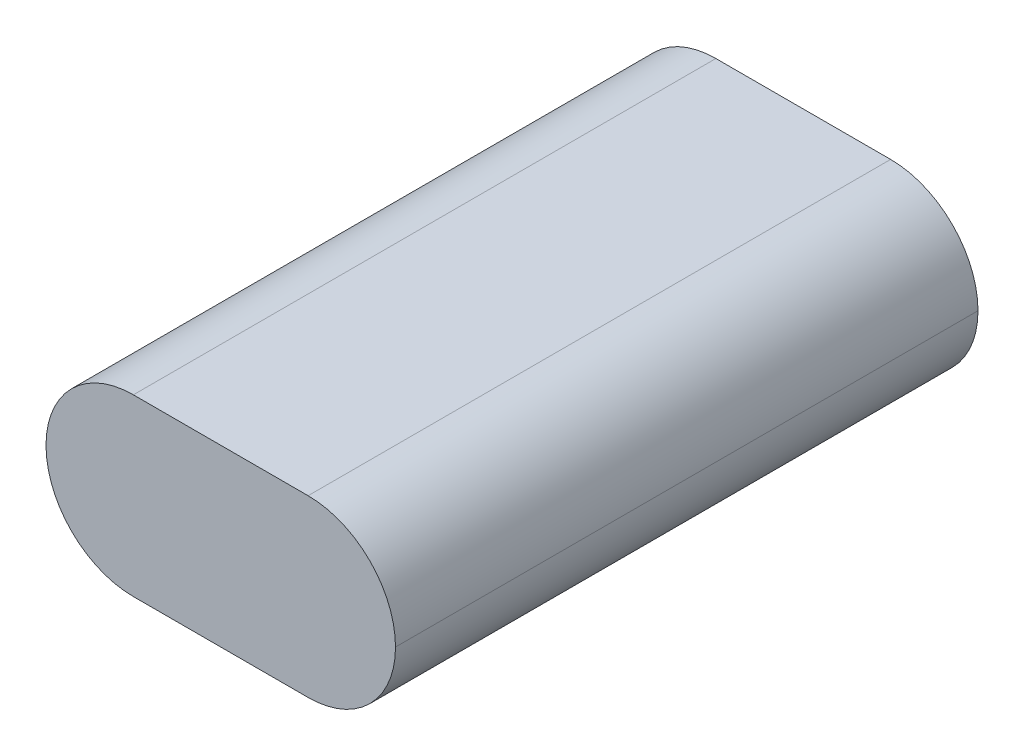
ISO-10303-21;
HEADER;
FILE_DESCRIPTION(('STEP AP214'),'2;1');
FILE_NAME('part.step','',(''),(''),'','','');
FILE_SCHEMA(('AUTOMOTIVE_DESIGN { 1 0 10303 214 1 1 1 1 }'));
ENDSEC;
DATA;
#1=APPLICATION_CONTEXT('core data for automotive mechanical design processes');
#2=APPLICATION_PROTOCOL_DEFINITION('international standard','automotive_design',2000,#1);
#3=PRODUCT_CONTEXT('',#1,'mechanical');
#4=PRODUCT('Part','Part','',(#3));
#5=PRODUCT_RELATED_PRODUCT_CATEGORY('part','',(#4));
#6=PRODUCT_DEFINITION_FORMATION('','',#4);
#7=PRODUCT_DEFINITION_CONTEXT('part definition',#1,'design');
#8=PRODUCT_DEFINITION('design','',#6,#7);
#9=PRODUCT_DEFINITION_SHAPE('','',#8);
#10=(LENGTH_UNIT() NAMED_UNIT(*) SI_UNIT(.MILLI.,.METRE.));
#11=(NAMED_UNIT(*) PLANE_ANGLE_UNIT() SI_UNIT($,.RADIAN.));
#12=(NAMED_UNIT(*) SI_UNIT($,.STERADIAN.) SOLID_ANGLE_UNIT());
#13=UNCERTAINTY_MEASURE_WITH_UNIT(LENGTH_MEASURE(1.E-05),#10,'distance_accuracy_value','');
#14=(GEOMETRIC_REPRESENTATION_CONTEXT(3) GLOBAL_UNCERTAINTY_ASSIGNED_CONTEXT((#13)) GLOBAL_UNIT_ASSIGNED_CONTEXT((#10,
#11,#12)) REPRESENTATION_CONTEXT('',''));
#15=CARTESIAN_POINT('',(0.,0.,0.));
#16=DIRECTION('',(0.,0.,1.));
#17=DIRECTION('',(1.,0.,0.));
#18=AXIS2_PLACEMENT_3D('',#15,#16,#17);
#19=CARTESIAN_POINT('',(0.,9.,0.));
#20=DIRECTION('',(0.,0.,-1.));
#21=DIRECTION('',(-1.,0.,0.));
#22=AXIS2_PLACEMENT_3D('',#19,#20,#21);
#23=PLANE('',#22);
#24=CARTESIAN_POINT('',(4.5,4.5,0.));
#25=DIRECTION('',(0.,0.,-1.));
#26=DIRECTION('',(-1.,0.,0.));
#27=AXIS2_PLACEMENT_3D('',#24,#25,#26);
#28=CIRCLE('',#27,4.5);
#29=CARTESIAN_POINT('',(4.5,9.,0.));
#30=VERTEX_POINT('',#29);
#31=CARTESIAN_POINT('',(0.,4.5,0.));
#32=VERTEX_POINT('',#31);
#33=EDGE_CURVE('E175',#30,#32,#28,.F.);
#34=ORIENTED_EDGE('',*,*,#33,.T.);
#35=CARTESIAN_POINT('',(4.5,4.5,0.));
#36=DIRECTION('',(0.,0.,-1.));
#37=DIRECTION('',(-1.,0.,0.));
#38=AXIS2_PLACEMENT_3D('',#35,#36,#37);
#39=CIRCLE('',#38,4.5);
#40=CARTESIAN_POINT('',(4.5,0.,0.));
#41=VERTEX_POINT('',#40);
#42=EDGE_CURVE('E177',#32,#41,#39,.F.);
#43=ORIENTED_EDGE('',*,*,#42,.T.);
#44=DIRECTION('',(1.,0.,0.));
#45=VECTOR('',#44,1.);
#46=CARTESIAN_POINT('',(0.,0.,0.));
#47=LINE('',#46,#45);
#48=CARTESIAN_POINT('',(13.5,0.,0.));
#49=VERTEX_POINT('',#48);
#50=EDGE_CURVE('E157',#41,#49,#47,.T.);
#51=ORIENTED_EDGE('',*,*,#50,.T.);
#52=CARTESIAN_POINT('',(13.5,4.5,0.));
#53=DIRECTION('',(0.,0.,-1.));
#54=DIRECTION('',(-1.,0.,0.));
#55=AXIS2_PLACEMENT_3D('',#52,#53,#54);
#56=CIRCLE('',#55,4.5);
#57=CARTESIAN_POINT('',(18.,4.5,0.));
#58=VERTEX_POINT('',#57);
#59=EDGE_CURVE('E173',#49,#58,#56,.F.);
#60=ORIENTED_EDGE('',*,*,#59,.T.);
#61=CARTESIAN_POINT('',(13.5,4.5,0.));
#62=DIRECTION('',(0.,0.,-1.));
#63=DIRECTION('',(-1.,0.,0.));
#64=AXIS2_PLACEMENT_3D('',#61,#62,#63);
#65=CIRCLE('',#64,4.5);
#66=CARTESIAN_POINT('',(13.5,9.,0.));
#67=VERTEX_POINT('',#66);
#68=EDGE_CURVE('E167',#58,#67,#65,.F.);
#69=ORIENTED_EDGE('',*,*,#68,.T.);
#70=DIRECTION('',(1.,0.,0.));
#71=VECTOR('',#70,1.);
#72=CARTESIAN_POINT('',(0.,9.,0.));
#73=LINE('',#72,#71);
#74=EDGE_CURVE('E161',#30,#67,#73,.T.);
#75=ORIENTED_EDGE('',*,*,#74,.F.);
#76=EDGE_LOOP('',(#34,#43,#51,#60,#69,#75));
#77=FACE_BOUND('',#76,.T.);
#78=ADVANCED_FACE('F39',(#77),#23,.F.);
#79=CARTESIAN_POINT('',(0.,9.,-30.));
#80=DIRECTION('',(0.,0.,1.));
#81=DIRECTION('',(1.,0.,0.));
#82=AXIS2_PLACEMENT_3D('',#79,#80,#81);
#83=PLANE('',#82);
#84=DIRECTION('',(1.,0.,0.));
#85=VECTOR('',#84,1.);
#86=CARTESIAN_POINT('',(15.25,7.05,-30.));
#87=LINE('',#86,#85);
#88=CARTESIAN_POINT('',(2.74999999999999,7.05,-30.));
#89=VERTEX_POINT('',#88);
#90=CARTESIAN_POINT('',(15.25,7.05,-30.));
#91=VERTEX_POINT('',#90);
#92=EDGE_CURVE('E150',#89,#91,#87,.T.);
#93=ORIENTED_EDGE('',*,*,#92,.F.);
#94=DIRECTION('',(0.,1.,0.));
#95=VECTOR('',#94,1.);
#96=CARTESIAN_POINT('',(2.74999999999999,7.05,-30.));
#97=LINE('',#96,#95);
#98=CARTESIAN_POINT('',(2.74999999999999,1.95,-30.));
#99=VERTEX_POINT('',#98);
#100=EDGE_CURVE('E124',#99,#89,#97,.T.);
#101=ORIENTED_EDGE('',*,*,#100,.F.);
#102=DIRECTION('',(-1.,0.,0.));
#103=VECTOR('',#102,1.);
#104=CARTESIAN_POINT('',(15.25,1.95,-30.));
#105=LINE('',#104,#103);
#106=CARTESIAN_POINT('',(15.25,1.95,-30.));
#107=VERTEX_POINT('',#106);
#108=EDGE_CURVE('E141',#107,#99,#105,.T.);
#109=ORIENTED_EDGE('',*,*,#108,.F.);
#110=DIRECTION('',(0.,-1.,0.));
#111=VECTOR('',#110,1.);
#112=CARTESIAN_POINT('',(15.25,7.05,-30.));
#113=LINE('',#112,#111);
#114=EDGE_CURVE('E144',#91,#107,#113,.T.);
#115=ORIENTED_EDGE('',*,*,#114,.F.);
#116=EDGE_LOOP('',(#93,#101,#109,#115));
#117=FACE_BOUND('',#116,.T.);
#118=DIRECTION('',(-1.,0.,0.));
#119=VECTOR('',#118,1.);
#120=CARTESIAN_POINT('',(0.,0.,-30.));
#121=LINE('',#120,#119);
#122=CARTESIAN_POINT('',(13.5,0.,-30.));
#123=VERTEX_POINT('',#122);
#124=CARTESIAN_POINT('',(4.5,0.,-30.));
#125=VERTEX_POINT('',#124);
#126=EDGE_CURVE('E165',#123,#125,#121,.T.);
#127=ORIENTED_EDGE('',*,*,#126,.T.);
#128=CARTESIAN_POINT('',(4.5,4.5,-30.));
#129=DIRECTION('',(0.,0.,1.));
#130=DIRECTION('',(1.,0.,0.));
#131=AXIS2_PLACEMENT_3D('',#128,#129,#130);
#132=CIRCLE('',#131,4.5);
#133=CARTESIAN_POINT('',(0.,4.5,-30.));
#134=VERTEX_POINT('',#133);
#135=EDGE_CURVE('E189',#125,#134,#132,.F.);
#136=ORIENTED_EDGE('',*,*,#135,.T.);
#137=CARTESIAN_POINT('',(4.5,4.5,-30.));
#138=DIRECTION('',(0.,0.,1.));
#139=DIRECTION('',(1.,0.,0.));
#140=AXIS2_PLACEMENT_3D('',#137,#138,#139);
#141=CIRCLE('',#140,4.5);
#142=CARTESIAN_POINT('',(4.5,9.,-30.));
#143=VERTEX_POINT('',#142);
#144=EDGE_CURVE('E62',#134,#143,#141,.F.);
#145=ORIENTED_EDGE('',*,*,#144,.T.);
#146=DIRECTION('',(-1.,0.,0.));
#147=VECTOR('',#146,1.);
#148=CARTESIAN_POINT('',(0.,9.,-30.));
#149=LINE('',#148,#147);
#150=CARTESIAN_POINT('',(13.5,9.,-30.));
#151=VERTEX_POINT('',#150);
#152=EDGE_CURVE('E164',#151,#143,#149,.T.);
#153=ORIENTED_EDGE('',*,*,#152,.F.);
#154=CARTESIAN_POINT('',(13.5,4.5,-30.));
#155=DIRECTION('',(0.,0.,1.));
#156=DIRECTION('',(1.,0.,0.));
#157=AXIS2_PLACEMENT_3D('',#154,#155,#156);
#158=CIRCLE('',#157,4.5);
#159=CARTESIAN_POINT('',(18.,4.5,-30.));
#160=VERTEX_POINT('',#159);
#161=EDGE_CURVE('E56',#151,#160,#158,.F.);
#162=ORIENTED_EDGE('',*,*,#161,.T.);
#163=CARTESIAN_POINT('',(13.5,4.5,-30.));
#164=DIRECTION('',(0.,0.,1.));
#165=DIRECTION('',(1.,0.,0.));
#166=AXIS2_PLACEMENT_3D('',#163,#164,#165);
#167=CIRCLE('',#166,4.5);
#168=EDGE_CURVE('E186',#160,#123,#167,.F.);
#169=ORIENTED_EDGE('',*,*,#168,.T.);
#170=EDGE_LOOP('',(#127,#136,#145,#153,#162,#169));
#171=FACE_BOUND('',#170,.T.);
#172=ADVANCED_FACE('F217',(#117,#171),#83,.F.);
#173=CARTESIAN_POINT('',(0.,9.,0.));
#174=DIRECTION('',(0.,-1.,0.));
#175=DIRECTION('',(0.,0.,-1.));
#176=AXIS2_PLACEMENT_3D('',#173,#174,#175);
#177=PLANE('',#176);
#178=ORIENTED_EDGE('',*,*,#152,.T.);
#179=DIRECTION('',(0.,0.,1.));
#180=VECTOR('',#179,1.);
#181=CARTESIAN_POINT('',(4.5,9.,0.));
#182=LINE('',#181,#180);
#183=EDGE_CURVE('E11',#143,#30,#182,.T.);
#184=ORIENTED_EDGE('',*,*,#183,.T.);
#185=ORIENTED_EDGE('',*,*,#74,.T.);
#186=DIRECTION('',(0.,0.,-1.));
#187=VECTOR('',#186,1.);
#188=CARTESIAN_POINT('',(13.5,9.,0.));
#189=LINE('',#188,#187);
#190=EDGE_CURVE('E48',#67,#151,#189,.T.);
#191=ORIENTED_EDGE('',*,*,#190,.T.);
#192=EDGE_LOOP('',(#178,#184,#185,#191));
#193=FACE_BOUND('',#192,.T.);
#194=ADVANCED_FACE('F207',(#193),#177,.F.);
#195=CARTESIAN_POINT('',(0.,0.,0.));
#196=DIRECTION('',(0.,-1.,0.));
#197=DIRECTION('',(0.,0.,-1.));
#198=AXIS2_PLACEMENT_3D('',#195,#196,#197);
#199=PLANE('',#198);
#200=ORIENTED_EDGE('',*,*,#50,.F.);
#201=DIRECTION('',(0.,0.,1.));
#202=VECTOR('',#201,1.);
#203=CARTESIAN_POINT('',(4.5,0.,-30.));
#204=LINE('',#203,#202);
#205=EDGE_CURVE('E182',#41,#125,#204,.F.);
#206=ORIENTED_EDGE('',*,*,#205,.T.);
#207=ORIENTED_EDGE('',*,*,#126,.F.);
#208=DIRECTION('',(0.,0.,-1.));
#209=VECTOR('',#208,1.);
#210=CARTESIAN_POINT('',(13.5,0.,0.));
#211=LINE('',#210,#209);
#212=EDGE_CURVE('E179',#123,#49,#211,.F.);
#213=ORIENTED_EDGE('',*,*,#212,.T.);
#214=EDGE_LOOP('',(#200,#206,#207,#213));
#215=FACE_BOUND('',#214,.T.);
#216=ADVANCED_FACE('F214',(#215),#199,.T.);
#217=CARTESIAN_POINT('',(2.74999999999999,7.05,-20.));
#218=DIRECTION('',(-1.,0.,0.));
#219=DIRECTION('',(0.,-1.,0.));
#220=AXIS2_PLACEMENT_3D('',#217,#218,#219);
#221=PLANE('',#220);
#222=ORIENTED_EDGE('',*,*,#100,.T.);
#223=DIRECTION('',(0.,0.,-1.));
#224=VECTOR('',#223,1.);
#225=CARTESIAN_POINT('',(2.74999999999999,7.05,-20.));
#226=LINE('',#225,#224);
#227=CARTESIAN_POINT('',(2.74999999999999,7.05,-20.));
#228=VERTEX_POINT('',#227);
#229=EDGE_CURVE('E117',#228,#89,#226,.T.);
#230=ORIENTED_EDGE('',*,*,#229,.F.);
#231=DIRECTION('',(0.,1.,0.));
#232=VECTOR('',#231,1.);
#233=CARTESIAN_POINT('',(2.74999999999999,7.05,-20.));
#234=LINE('',#233,#232);
#235=CARTESIAN_POINT('',(2.74999999999999,1.95,-20.));
#236=VERTEX_POINT('',#235);
#237=EDGE_CURVE('E121',#236,#228,#234,.T.);
#238=ORIENTED_EDGE('',*,*,#237,.F.);
#239=DIRECTION('',(0.,0.,-1.));
#240=VECTOR('',#239,1.);
#241=CARTESIAN_POINT('',(2.74999999999999,1.95,-20.));
#242=LINE('',#241,#240);
#243=EDGE_CURVE('E155',#236,#99,#242,.T.);
#244=ORIENTED_EDGE('',*,*,#243,.T.);
#245=EDGE_LOOP('',(#222,#230,#238,#244));
#246=FACE_BOUND('',#245,.T.);
#247=ADVANCED_FACE('F119',(#246),#221,.F.);
#248=CARTESIAN_POINT('',(15.25,1.95,-20.));
#249=DIRECTION('',(0.,-1.,0.));
#250=DIRECTION('',(0.,0.,-1.));
#251=AXIS2_PLACEMENT_3D('',#248,#249,#250);
#252=PLANE('',#251);
#253=ORIENTED_EDGE('',*,*,#108,.T.);
#254=ORIENTED_EDGE('',*,*,#243,.F.);
#255=DIRECTION('',(-1.,0.,0.));
#256=VECTOR('',#255,1.);
#257=CARTESIAN_POINT('',(15.25,1.95,-20.));
#258=LINE('',#257,#256);
#259=CARTESIAN_POINT('',(15.25,1.95,-20.));
#260=VERTEX_POINT('',#259);
#261=EDGE_CURVE('E129',#260,#236,#258,.T.);
#262=ORIENTED_EDGE('',*,*,#261,.F.);
#263=DIRECTION('',(0.,0.,-1.));
#264=VECTOR('',#263,1.);
#265=CARTESIAN_POINT('',(15.25,1.95,-20.));
#266=LINE('',#265,#264);
#267=EDGE_CURVE('E158',#260,#107,#266,.T.);
#268=ORIENTED_EDGE('',*,*,#267,.T.);
#269=EDGE_LOOP('',(#253,#254,#262,#268));
#270=FACE_BOUND('',#269,.T.);
#271=ADVANCED_FACE('F293',(#270),#252,.F.);
#272=CARTESIAN_POINT('',(15.25,7.05,-20.));
#273=DIRECTION('',(1.,0.,0.));
#274=DIRECTION('',(0.,0.,-1.));
#275=AXIS2_PLACEMENT_3D('',#272,#273,#274);
#276=PLANE('',#275);
#277=ORIENTED_EDGE('',*,*,#114,.T.);
#278=ORIENTED_EDGE('',*,*,#267,.F.);
#279=DIRECTION('',(0.,-1.,0.));
#280=VECTOR('',#279,1.);
#281=CARTESIAN_POINT('',(15.25,7.05,-20.));
#282=LINE('',#281,#280);
#283=CARTESIAN_POINT('',(15.25,7.05,-20.));
#284=VERTEX_POINT('',#283);
#285=EDGE_CURVE('E137',#284,#260,#282,.T.);
#286=ORIENTED_EDGE('',*,*,#285,.F.);
#287=DIRECTION('',(0.,0.,-1.));
#288=VECTOR('',#287,1.);
#289=CARTESIAN_POINT('',(15.25,7.05,-20.));
#290=LINE('',#289,#288);
#291=EDGE_CURVE('E128',#284,#91,#290,.T.);
#292=ORIENTED_EDGE('',*,*,#291,.T.);
#293=EDGE_LOOP('',(#277,#278,#286,#292));
#294=FACE_BOUND('',#293,.T.);
#295=ADVANCED_FACE('F285',(#294),#276,.F.);
#296=CARTESIAN_POINT('',(15.25,7.05,-20.));
#297=DIRECTION('',(0.,1.,0.));
#298=DIRECTION('',(0.,0.,1.));
#299=AXIS2_PLACEMENT_3D('',#296,#297,#298);
#300=PLANE('',#299);
#301=ORIENTED_EDGE('',*,*,#92,.T.);
#302=ORIENTED_EDGE('',*,*,#291,.F.);
#303=DIRECTION('',(1.,0.,0.));
#304=VECTOR('',#303,1.);
#305=CARTESIAN_POINT('',(15.25,7.05,-20.));
#306=LINE('',#305,#304);
#307=EDGE_CURVE('E132',#228,#284,#306,.T.);
#308=ORIENTED_EDGE('',*,*,#307,.F.);
#309=ORIENTED_EDGE('',*,*,#229,.T.);
#310=EDGE_LOOP('',(#301,#302,#308,#309));
#311=FACE_BOUND('',#310,.T.);
#312=ADVANCED_FACE('F133',(#311),#300,.F.);
#313=CARTESIAN_POINT('',(0.,0.,-20.));
#314=DIRECTION('',(0.,0.,-1.));
#315=DIRECTION('',(-1.,0.,0.));
#316=AXIS2_PLACEMENT_3D('',#313,#314,#315);
#317=PLANE('',#316);
#318=ORIENTED_EDGE('',*,*,#237,.T.);
#319=ORIENTED_EDGE('',*,*,#307,.T.);
#320=ORIENTED_EDGE('',*,*,#285,.T.);
#321=ORIENTED_EDGE('',*,*,#261,.T.);
#322=EDGE_LOOP('',(#318,#319,#320,#321));
#323=FACE_BOUND('',#322,.T.);
#324=ADVANCED_FACE('F139',(#323),#317,.T.);
#325=CARTESIAN_POINT('',(4.5,4.5,0.));
#326=DIRECTION('',(0.,0.,1.));
#327=DIRECTION('',(1.,0.,0.));
#328=AXIS2_PLACEMENT_3D('',#325,#326,#327);
#329=CYLINDRICAL_SURFACE('',#328,4.5);
#330=ORIENTED_EDGE('',*,*,#183,.F.);
#331=ORIENTED_EDGE('',*,*,#144,.F.);
#332=DIRECTION('',(0.,0.,1.));
#333=VECTOR('',#332,1.);
#334=CARTESIAN_POINT('',(0.,4.5,0.));
#335=LINE('',#334,#333);
#336=EDGE_CURVE('E151',#32,#134,#335,.F.);
#337=ORIENTED_EDGE('',*,*,#336,.F.);
#338=ORIENTED_EDGE('',*,*,#33,.F.);
#339=EDGE_LOOP('',(#330,#331,#337,#338));
#340=FACE_BOUND('',#339,.T.);
#341=ADVANCED_FACE('F210',(#340),#329,.T.);
#342=CARTESIAN_POINT('',(4.5,4.5,0.));
#343=DIRECTION('',(0.,0.,-1.));
#344=DIRECTION('',(-1.,0.,0.));
#345=AXIS2_PLACEMENT_3D('',#342,#343,#344);
#346=CYLINDRICAL_SURFACE('',#345,4.5);
#347=ORIENTED_EDGE('',*,*,#135,.F.);
#348=ORIENTED_EDGE('',*,*,#205,.F.);
#349=ORIENTED_EDGE('',*,*,#42,.F.);
#350=ORIENTED_EDGE('',*,*,#336,.T.);
#351=EDGE_LOOP('',(#347,#348,#349,#350));
#352=FACE_BOUND('',#351,.T.);
#353=ADVANCED_FACE('F216',(#352),#346,.T.);
#354=CARTESIAN_POINT('',(13.5,4.5,0.));
#355=DIRECTION('',(0.,0.,-1.));
#356=DIRECTION('',(-1.,0.,0.));
#357=AXIS2_PLACEMENT_3D('',#354,#355,#356);
#358=CYLINDRICAL_SURFACE('',#357,4.5);
#359=ORIENTED_EDGE('',*,*,#190,.F.);
#360=ORIENTED_EDGE('',*,*,#68,.F.);
#361=DIRECTION('',(0.,0.,-1.));
#362=VECTOR('',#361,1.);
#363=CARTESIAN_POINT('',(18.,4.5,0.));
#364=LINE('',#363,#362);
#365=EDGE_CURVE('E43',#160,#58,#364,.F.);
#366=ORIENTED_EDGE('',*,*,#365,.F.);
#367=ORIENTED_EDGE('',*,*,#161,.F.);
#368=EDGE_LOOP('',(#359,#360,#366,#367));
#369=FACE_BOUND('',#368,.T.);
#370=ADVANCED_FACE('F41',(#369),#358,.T.);
#371=CARTESIAN_POINT('',(13.5,4.5,0.));
#372=DIRECTION('',(0.,0.,1.));
#373=DIRECTION('',(1.,0.,0.));
#374=AXIS2_PLACEMENT_3D('',#371,#372,#373);
#375=CYLINDRICAL_SURFACE('',#374,4.5);
#376=ORIENTED_EDGE('',*,*,#59,.F.);
#377=ORIENTED_EDGE('',*,*,#212,.F.);
#378=ORIENTED_EDGE('',*,*,#168,.F.);
#379=ORIENTED_EDGE('',*,*,#365,.T.);
#380=EDGE_LOOP('',(#376,#377,#378,#379));
#381=FACE_BOUND('',#380,.T.);
#382=ADVANCED_FACE('F198',(#381),#375,.T.);
#383=CLOSED_SHELL('',(#78,#172,#194,#216,#247,#271,#295,#312,#324,#341,#353,#370,#382));
#384=MANIFOLD_SOLID_BREP('B2',#383);
#385=ADVANCED_BREP_SHAPE_REPRESENTATION('',(#18,#384),#14);
#386=SHAPE_DEFINITION_REPRESENTATION(#9,#385);
ENDSEC;
END-ISO-10303-21;
